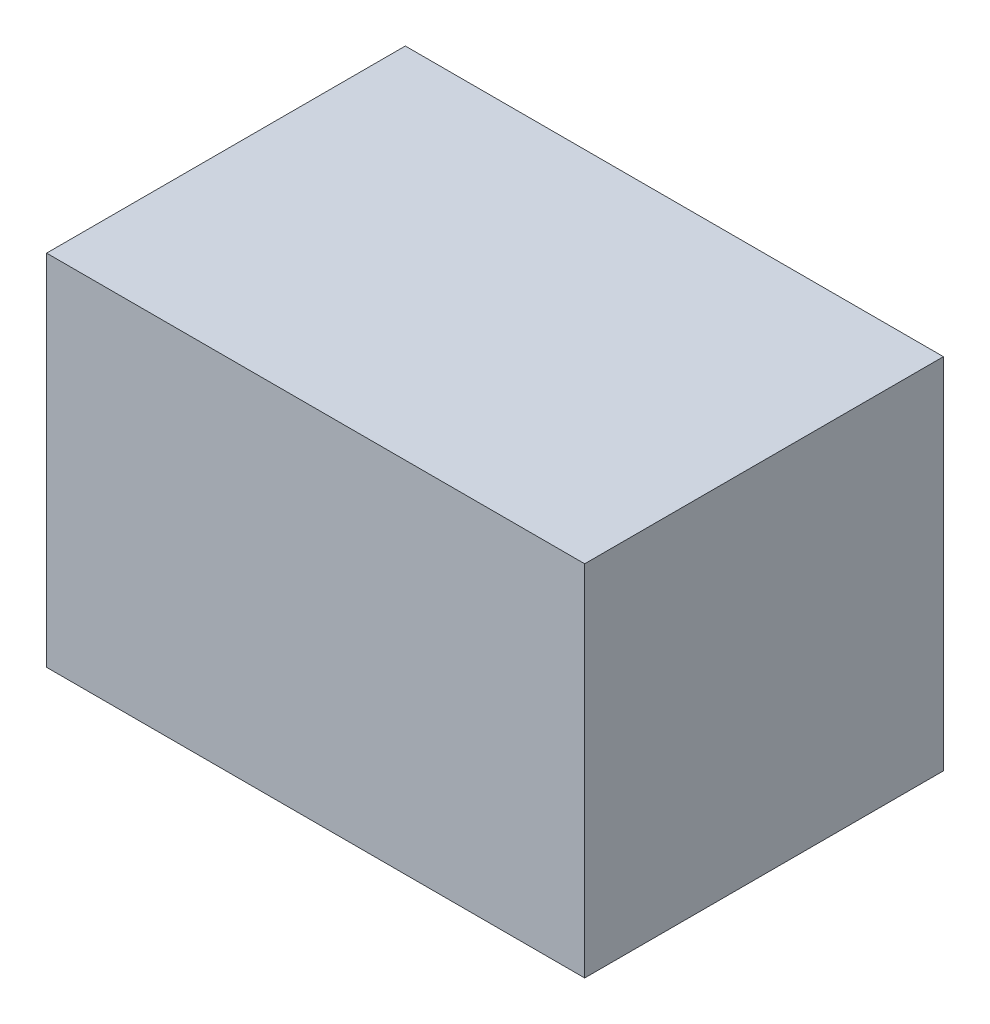
ISO-10303-21;
HEADER;
FILE_DESCRIPTION(('STEP AP214'),'2;1');
FILE_NAME('part.step','',(''),(''),'','','');
FILE_SCHEMA(('AUTOMOTIVE_DESIGN { 1 0 10303 214 1 1 1 1 }'));
ENDSEC;
DATA;
#1=APPLICATION_CONTEXT('core data for automotive mechanical design processes');
#2=APPLICATION_PROTOCOL_DEFINITION('international standard','automotive_design',2000,#1);
#3=PRODUCT_CONTEXT('',#1,'mechanical');
#4=PRODUCT('Part','Part','',(#3));
#5=PRODUCT_RELATED_PRODUCT_CATEGORY('part','',(#4));
#6=PRODUCT_DEFINITION_FORMATION('','',#4);
#7=PRODUCT_DEFINITION_CONTEXT('part definition',#1,'design');
#8=PRODUCT_DEFINITION('design','',#6,#7);
#9=PRODUCT_DEFINITION_SHAPE('','',#8);
#10=(LENGTH_UNIT() NAMED_UNIT(*) SI_UNIT(.MILLI.,.METRE.));
#11=(NAMED_UNIT(*) PLANE_ANGLE_UNIT() SI_UNIT($,.RADIAN.));
#12=(NAMED_UNIT(*) SI_UNIT($,.STERADIAN.) SOLID_ANGLE_UNIT());
#13=UNCERTAINTY_MEASURE_WITH_UNIT(LENGTH_MEASURE(1.E-05),#10,'distance_accuracy_value','');
#14=(GEOMETRIC_REPRESENTATION_CONTEXT(3) GLOBAL_UNCERTAINTY_ASSIGNED_CONTEXT((#13)) GLOBAL_UNIT_ASSIGNED_CONTEXT((#10,
#11,#12)) REPRESENTATION_CONTEXT('',''));
#15=CARTESIAN_POINT('',(0.,0.,0.));
#16=DIRECTION('',(0.,0.,1.));
#17=DIRECTION('',(1.,0.,0.));
#18=AXIS2_PLACEMENT_3D('',#15,#16,#17);
#19=CARTESIAN_POINT('',(0.,0.,0.));
#20=DIRECTION('',(0.,1.,0.));
#21=DIRECTION('',(1.,0.,0.));
#22=AXIS2_PLACEMENT_3D('',#19,#20,#21);
#23=PLANE('',#22);
#24=DIRECTION('',(0.,0.,-1.));
#25=VECTOR('',#24,1.);
#26=CARTESIAN_POINT('',(-13.8,0.,-0.65));
#27=LINE('',#26,#25);
#28=CARTESIAN_POINT('',(-13.8,0.,-17.3));
#29=VERTEX_POINT('',#28);
#30=CARTESIAN_POINT('',(-13.8,0.,-18.3));
#31=VERTEX_POINT('',#30);
#32=EDGE_CURVE('E113',#29,#31,#27,.T.);
#33=ORIENTED_EDGE('',*,*,#32,.F.);
#34=DIRECTION('',(-1.,0.,0.));
#35=VECTOR('',#34,1.);
#36=CARTESIAN_POINT('',(-9.25,0.,-17.3));
#37=LINE('',#36,#35);
#38=CARTESIAN_POINT('',(-12.3,0.,-17.3));
#39=VERTEX_POINT('',#38);
#40=EDGE_CURVE('E26',#39,#29,#37,.T.);
#41=ORIENTED_EDGE('',*,*,#40,.F.);
#42=DIRECTION('',(0.,0.,-1.));
#43=VECTOR('',#42,1.);
#44=CARTESIAN_POINT('',(-12.3,0.,-0.65));
#45=LINE('',#44,#43);
#46=CARTESIAN_POINT('',(-12.3,0.,-18.3));
#47=VERTEX_POINT('',#46);
#48=EDGE_CURVE('E77',#39,#47,#45,.T.);
#49=ORIENTED_EDGE('',*,*,#48,.T.);
#50=DIRECTION('',(-1.,0.,0.));
#51=VECTOR('',#50,1.);
#52=CARTESIAN_POINT('',(-9.25,0.,-18.3));
#53=LINE('',#52,#51);
#54=EDGE_CURVE('E81',#47,#31,#53,.T.);
#55=ORIENTED_EDGE('',*,*,#54,.T.);
#56=EDGE_LOOP('',(#33,#41,#49,#55));
#57=FACE_BOUND('',#56,.T.);
#58=ADVANCED_FACE('F17',(#57),#23,.T.);
#59=CARTESIAN_POINT('',(0.,-1.,0.));
#60=DIRECTION('',(0.,1.,0.));
#61=DIRECTION('',(1.,0.,0.));
#62=AXIS2_PLACEMENT_3D('',#59,#60,#61);
#63=PLANE('',#62);
#64=DIRECTION('',(0.,0.,-1.));
#65=VECTOR('',#64,1.);
#66=CARTESIAN_POINT('',(-13.8,-1.,-0.65));
#67=LINE('',#66,#65);
#68=CARTESIAN_POINT('',(-13.8,-1.,-17.3));
#69=VERTEX_POINT('',#68);
#70=CARTESIAN_POINT('',(-13.8,-1.,-18.3));
#71=VERTEX_POINT('',#70);
#72=EDGE_CURVE('E72',#69,#71,#67,.T.);
#73=ORIENTED_EDGE('',*,*,#72,.T.);
#74=DIRECTION('',(-1.,0.,0.));
#75=VECTOR('',#74,1.);
#76=CARTESIAN_POINT('',(-9.25,-1.,-18.3));
#77=LINE('',#76,#75);
#78=CARTESIAN_POINT('',(-12.3,-1.,-18.3));
#79=VERTEX_POINT('',#78);
#80=EDGE_CURVE('E69',#79,#71,#77,.T.);
#81=ORIENTED_EDGE('',*,*,#80,.F.);
#82=DIRECTION('',(0.,0.,-1.));
#83=VECTOR('',#82,1.);
#84=CARTESIAN_POINT('',(-12.3,-1.,-0.65));
#85=LINE('',#84,#83);
#86=CARTESIAN_POINT('',(-12.3,-1.,-17.3));
#87=VERTEX_POINT('',#86);
#88=EDGE_CURVE('E56',#87,#79,#85,.T.);
#89=ORIENTED_EDGE('',*,*,#88,.F.);
#90=DIRECTION('',(-1.,0.,0.));
#91=VECTOR('',#90,1.);
#92=CARTESIAN_POINT('',(-9.25,-1.,-17.3));
#93=LINE('',#92,#91);
#94=EDGE_CURVE('E11',#87,#69,#93,.T.);
#95=ORIENTED_EDGE('',*,*,#94,.T.);
#96=EDGE_LOOP('',(#73,#81,#89,#95));
#97=FACE_BOUND('',#96,.T.);
#98=ADVANCED_FACE('F70',(#97),#63,.F.);
#99=CARTESIAN_POINT('',(-9.25,-1.,-17.3));
#100=DIRECTION('',(0.,0.,-1.));
#101=DIRECTION('',(0.,-1.,0.));
#102=AXIS2_PLACEMENT_3D('',#99,#100,#101);
#103=PLANE('',#102);
#104=ORIENTED_EDGE('',*,*,#40,.T.);
#105=DIRECTION('',(0.,1.,0.));
#106=VECTOR('',#105,1.);
#107=CARTESIAN_POINT('',(-13.8,-1.,-17.3));
#108=LINE('',#107,#106);
#109=EDGE_CURVE('E88',#69,#29,#108,.T.);
#110=ORIENTED_EDGE('',*,*,#109,.F.);
#111=ORIENTED_EDGE('',*,*,#94,.F.);
#112=DIRECTION('',(0.,1.,0.));
#113=VECTOR('',#112,1.);
#114=CARTESIAN_POINT('',(-12.3,-1.,-17.3));
#115=LINE('',#114,#113);
#116=EDGE_CURVE('E63',#87,#39,#115,.T.);
#117=ORIENTED_EDGE('',*,*,#116,.T.);
#118=EDGE_LOOP('',(#104,#110,#111,#117));
#119=FACE_BOUND('',#118,.T.);
#120=ADVANCED_FACE('F105',(#119),#103,.F.);
#121=CARTESIAN_POINT('',(-12.3,-1.,-0.65));
#122=DIRECTION('',(1.,0.,0.));
#123=DIRECTION('',(0.,1.,0.));
#124=AXIS2_PLACEMENT_3D('',#121,#122,#123);
#125=PLANE('',#124);
#126=ORIENTED_EDGE('',*,*,#48,.F.);
#127=ORIENTED_EDGE('',*,*,#116,.F.);
#128=ORIENTED_EDGE('',*,*,#88,.T.);
#129=DIRECTION('',(0.,1.,0.));
#130=VECTOR('',#129,1.);
#131=CARTESIAN_POINT('',(-12.3,-1.,-18.3));
#132=LINE('',#131,#130);
#133=EDGE_CURVE('E61',#79,#47,#132,.T.);
#134=ORIENTED_EDGE('',*,*,#133,.T.);
#135=EDGE_LOOP('',(#126,#127,#128,#134));
#136=FACE_BOUND('',#135,.T.);
#137=ADVANCED_FACE('F59',(#136),#125,.T.);
#138=CARTESIAN_POINT('',(-9.25,-1.,-18.3));
#139=DIRECTION('',(0.,0.,-1.));
#140=DIRECTION('',(0.,-1.,0.));
#141=AXIS2_PLACEMENT_3D('',#138,#139,#140);
#142=PLANE('',#141);
#143=ORIENTED_EDGE('',*,*,#54,.F.);
#144=ORIENTED_EDGE('',*,*,#133,.F.);
#145=ORIENTED_EDGE('',*,*,#80,.T.);
#146=DIRECTION('',(0.,1.,0.));
#147=VECTOR('',#146,1.);
#148=CARTESIAN_POINT('',(-13.8,-1.,-18.3));
#149=LINE('',#148,#147);
#150=EDGE_CURVE('E91',#71,#31,#149,.T.);
#151=ORIENTED_EDGE('',*,*,#150,.T.);
#152=EDGE_LOOP('',(#143,#144,#145,#151));
#153=FACE_BOUND('',#152,.T.);
#154=ADVANCED_FACE('F79',(#153),#142,.T.);
#155=CARTESIAN_POINT('',(-13.8,-1.,-0.65));
#156=DIRECTION('',(1.,0.,0.));
#157=DIRECTION('',(0.,1.,0.));
#158=AXIS2_PLACEMENT_3D('',#155,#156,#157);
#159=PLANE('',#158);
#160=ORIENTED_EDGE('',*,*,#32,.T.);
#161=ORIENTED_EDGE('',*,*,#150,.F.);
#162=ORIENTED_EDGE('',*,*,#72,.F.);
#163=ORIENTED_EDGE('',*,*,#109,.T.);
#164=EDGE_LOOP('',(#160,#161,#162,#163));
#165=FACE_BOUND('',#164,.T.);
#166=ADVANCED_FACE('F112',(#165),#159,.F.);
#167=CLOSED_SHELL('',(#58,#98,#120,#137,#154,#166));
#168=MANIFOLD_SOLID_BREP('B1',#167);
#169=ADVANCED_BREP_SHAPE_REPRESENTATION('',(#18,#168),#14);
#170=SHAPE_DEFINITION_REPRESENTATION(#9,#169);
ENDSEC;
END-ISO-10303-21;
